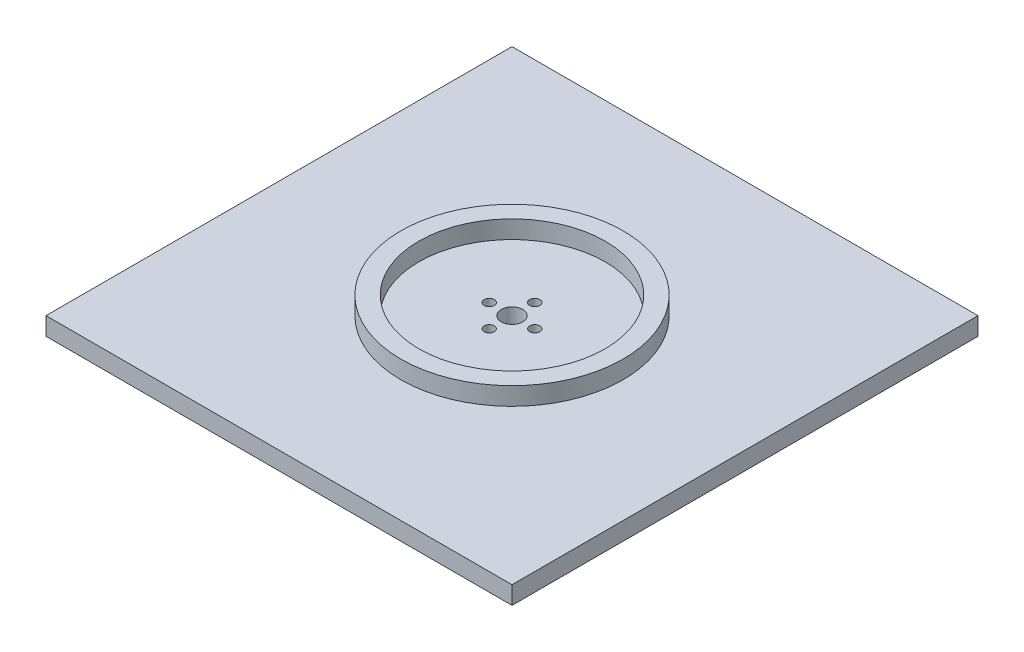
ISO-10303-21;
HEADER;
FILE_DESCRIPTION(('STEP AP214'),'2;1');
FILE_NAME('part.step','',(''),(''),'','','');
FILE_SCHEMA(('AUTOMOTIVE_DESIGN { 1 0 10303 214 1 1 1 1 }'));
ENDSEC;
DATA;
#1=APPLICATION_CONTEXT('core data for automotive mechanical design processes');
#2=APPLICATION_PROTOCOL_DEFINITION('international standard','automotive_design',2000,#1);
#3=PRODUCT_CONTEXT('',#1,'mechanical');
#4=PRODUCT('Part','Part','',(#3));
#5=PRODUCT_RELATED_PRODUCT_CATEGORY('part','',(#4));
#6=PRODUCT_DEFINITION_FORMATION('','',#4);
#7=PRODUCT_DEFINITION_CONTEXT('part definition',#1,'design');
#8=PRODUCT_DEFINITION('design','',#6,#7);
#9=PRODUCT_DEFINITION_SHAPE('','',#8);
#10=(LENGTH_UNIT() NAMED_UNIT(*) SI_UNIT(.MILLI.,.METRE.));
#11=(NAMED_UNIT(*) PLANE_ANGLE_UNIT() SI_UNIT($,.RADIAN.));
#12=(NAMED_UNIT(*) SI_UNIT($,.STERADIAN.) SOLID_ANGLE_UNIT());
#13=UNCERTAINTY_MEASURE_WITH_UNIT(LENGTH_MEASURE(1.E-05),#10,'distance_accuracy_value','');
#14=(GEOMETRIC_REPRESENTATION_CONTEXT(3) GLOBAL_UNCERTAINTY_ASSIGNED_CONTEXT((#13)) GLOBAL_UNIT_ASSIGNED_CONTEXT((#10,
#11,#12)) REPRESENTATION_CONTEXT('',''));
#15=CARTESIAN_POINT('',(0.,0.,0.));
#16=DIRECTION('',(0.,0.,1.));
#17=DIRECTION('',(1.,0.,0.));
#18=AXIS2_PLACEMENT_3D('',#15,#16,#17);
#19=CARTESIAN_POINT('',(0.,0.,-6.35));
#20=DIRECTION('',(0.,1.,0.));
#21=DIRECTION('',(0.,0.,1.));
#22=AXIS2_PLACEMENT_3D('',#19,#20,#21);
#23=CYLINDRICAL_SURFACE('',#22,1.42);
#24=CARTESIAN_POINT('',(0.,5.,-6.35));
#25=DIRECTION('',(0.,1.,0.));
#26=DIRECTION('',(0.,0.,1.));
#27=AXIS2_PLACEMENT_3D('',#24,#25,#26);
#28=CIRCLE('',#27,1.42);
#29=CARTESIAN_POINT('',(0.,5.,-4.93));
#30=VERTEX_POINT('',#29);
#31=EDGE_CURVE('E156',#30,#30,#28,.T.);
#32=ORIENTED_EDGE('',*,*,#31,.T.);
#33=EDGE_LOOP('',(#32));
#34=FACE_BOUND('',#33,.T.);
#35=CARTESIAN_POINT('',(0.,3.,-6.35));
#36=DIRECTION('',(0.,-1.,0.));
#37=DIRECTION('',(0.,0.,-1.));
#38=AXIS2_PLACEMENT_3D('',#35,#36,#37);
#39=CIRCLE('',#38,1.42);
#40=CARTESIAN_POINT('',(0.,3.,-7.77));
#41=VERTEX_POINT('',#40);
#42=EDGE_CURVE('E43',#41,#41,#39,.F.);
#43=ORIENTED_EDGE('',*,*,#42,.F.);
#44=EDGE_LOOP('',(#43));
#45=FACE_BOUND('',#44,.T.);
#46=ADVANCED_FACE('F39',(#34,#45),#23,.F.);
#47=CARTESIAN_POINT('',(3.59400408331214E-13,0.,6.35));
#48=DIRECTION('',(0.,1.,0.));
#49=DIRECTION('',(0.,0.,1.));
#50=AXIS2_PLACEMENT_3D('',#47,#48,#49);
#51=CYLINDRICAL_SURFACE('',#50,1.42);
#52=CARTESIAN_POINT('',(3.59400408331214E-13,5.,6.35));
#53=DIRECTION('',(0.,1.,0.));
#54=DIRECTION('',(0.,0.,1.));
#55=AXIS2_PLACEMENT_3D('',#52,#53,#54);
#56=CIRCLE('',#55,1.42);
#57=CARTESIAN_POINT('',(3.59400408331214E-13,5.,7.77));
#58=VERTEX_POINT('',#57);
#59=EDGE_CURVE('E147',#58,#58,#56,.T.);
#60=ORIENTED_EDGE('',*,*,#59,.T.);
#61=EDGE_LOOP('',(#60));
#62=FACE_BOUND('',#61,.T.);
#63=CARTESIAN_POINT('',(3.59400408331214E-13,3.,6.35));
#64=DIRECTION('',(0.,-1.,0.));
#65=DIRECTION('',(0.,0.,-1.));
#66=AXIS2_PLACEMENT_3D('',#63,#64,#65);
#67=CIRCLE('',#66,1.42);
#68=CARTESIAN_POINT('',(3.59400408331214E-13,3.,4.93));
#69=VERTEX_POINT('',#68);
#70=EDGE_CURVE('E127',#69,#69,#67,.F.);
#71=ORIENTED_EDGE('',*,*,#70,.F.);
#72=EDGE_LOOP('',(#71));
#73=FACE_BOUND('',#72,.T.);
#74=ADVANCED_FACE('F192',(#62,#73),#51,.F.);
#75=CARTESIAN_POINT('',(-6.34999999999982,0.,1.80477854883065E-13));
#76=DIRECTION('',(0.,1.,0.));
#77=DIRECTION('',(0.,0.,1.));
#78=AXIS2_PLACEMENT_3D('',#75,#76,#77);
#79=CYLINDRICAL_SURFACE('',#78,1.42);
#80=CARTESIAN_POINT('',(-6.34999999999982,5.,1.80477854883065E-13));
#81=DIRECTION('',(0.,1.,0.));
#82=DIRECTION('',(0.,0.,1.));
#83=AXIS2_PLACEMENT_3D('',#80,#81,#82);
#84=CIRCLE('',#83,1.42);
#85=CARTESIAN_POINT('',(-6.34999999999982,5.,1.42000000000018));
#86=VERTEX_POINT('',#85);
#87=EDGE_CURVE('E144',#86,#86,#84,.T.);
#88=ORIENTED_EDGE('',*,*,#87,.T.);
#89=EDGE_LOOP('',(#88));
#90=FACE_BOUND('',#89,.T.);
#91=CARTESIAN_POINT('',(-6.34999999999982,3.,1.80477854883065E-13));
#92=DIRECTION('',(0.,-1.,0.));
#93=DIRECTION('',(0.,0.,-1.));
#94=AXIS2_PLACEMENT_3D('',#91,#92,#93);
#95=CIRCLE('',#94,1.42);
#96=CARTESIAN_POINT('',(-6.34999999999982,3.,-1.41999999999982));
#97=VERTEX_POINT('',#96);
#98=EDGE_CURVE('E125',#97,#97,#95,.F.);
#99=ORIENTED_EDGE('',*,*,#98,.F.);
#100=EDGE_LOOP('',(#99));
#101=FACE_BOUND('',#100,.T.);
#102=ADVANCED_FACE('F199',(#90,#101),#79,.F.);
#103=CARTESIAN_POINT('',(6.35000000000018,0.,-1.79700204165607E-13));
#104=DIRECTION('',(0.,1.,0.));
#105=DIRECTION('',(0.,0.,1.));
#106=AXIS2_PLACEMENT_3D('',#103,#104,#105);
#107=CYLINDRICAL_SURFACE('',#106,1.42);
#108=CARTESIAN_POINT('',(6.35000000000018,5.,-1.79700204165607E-13));
#109=DIRECTION('',(0.,1.,0.));
#110=DIRECTION('',(0.,0.,1.));
#111=AXIS2_PLACEMENT_3D('',#108,#109,#110);
#112=CIRCLE('',#111,1.42);
#113=CARTESIAN_POINT('',(6.35000000000018,5.,1.41999999999982));
#114=VERTEX_POINT('',#113);
#115=EDGE_CURVE('E153',#114,#114,#112,.T.);
#116=ORIENTED_EDGE('',*,*,#115,.T.);
#117=EDGE_LOOP('',(#116));
#118=FACE_BOUND('',#117,.T.);
#119=CARTESIAN_POINT('',(6.35000000000018,3.,-1.79700204165607E-13));
#120=DIRECTION('',(0.,-1.,0.));
#121=DIRECTION('',(0.,0.,-1.));
#122=AXIS2_PLACEMENT_3D('',#119,#120,#121);
#123=CIRCLE('',#122,1.42);
#124=CARTESIAN_POINT('',(6.35000000000018,3.,-1.42000000000018));
#125=VERTEX_POINT('',#124);
#126=EDGE_CURVE('E120',#125,#125,#123,.F.);
#127=ORIENTED_EDGE('',*,*,#126,.F.);
#128=EDGE_LOOP('',(#127));
#129=FACE_BOUND('',#128,.T.);
#130=ADVANCED_FACE('F240',(#118,#129),#107,.F.);
#131=CARTESIAN_POINT('',(0.,5.,65.));
#132=DIRECTION('',(0.,0.,-1.));
#133=DIRECTION('',(-1.,0.,0.));
#134=AXIS2_PLACEMENT_3D('',#131,#132,#133);
#135=PLANE('',#134);
#136=DIRECTION('',(1.,0.,0.));
#137=VECTOR('',#136,1.);
#138=CARTESIAN_POINT('',(0.,0.,65.));
#139=LINE('',#138,#137);
#140=CARTESIAN_POINT('',(-65.,0.,65.));
#141=VERTEX_POINT('',#140);
#142=CARTESIAN_POINT('',(65.,0.,65.));
#143=VERTEX_POINT('',#142);
#144=EDGE_CURVE('E108',#141,#143,#139,.T.);
#145=ORIENTED_EDGE('',*,*,#144,.T.);
#146=DIRECTION('',(0.,-1.,0.));
#147=VECTOR('',#146,1.);
#148=CARTESIAN_POINT('',(65.,5.,65.));
#149=LINE('',#148,#147);
#150=CARTESIAN_POINT('',(65.,5.,65.));
#151=VERTEX_POINT('',#150);
#152=EDGE_CURVE('E49',#151,#143,#149,.T.);
#153=ORIENTED_EDGE('',*,*,#152,.F.);
#154=DIRECTION('',(1.,0.,0.));
#155=VECTOR('',#154,1.);
#156=CARTESIAN_POINT('',(0.,5.,65.));
#157=LINE('',#156,#155);
#158=CARTESIAN_POINT('',(-65.,5.,65.));
#159=VERTEX_POINT('',#158);
#160=EDGE_CURVE('E92',#159,#151,#157,.T.);
#161=ORIENTED_EDGE('',*,*,#160,.F.);
#162=DIRECTION('',(0.,-1.,0.));
#163=VECTOR('',#162,1.);
#164=CARTESIAN_POINT('',(-65.,5.,65.));
#165=LINE('',#164,#163);
#166=EDGE_CURVE('E58',#159,#141,#165,.T.);
#167=ORIENTED_EDGE('',*,*,#166,.T.);
#168=EDGE_LOOP('',(#145,#153,#161,#167));
#169=FACE_BOUND('',#168,.T.);
#170=ADVANCED_FACE('F41',(#169),#135,.F.);
#171=CARTESIAN_POINT('',(65.,5.,0.));
#172=DIRECTION('',(-1.,0.,0.));
#173=DIRECTION('',(0.,0.,1.));
#174=AXIS2_PLACEMENT_3D('',#171,#172,#173);
#175=PLANE('',#174);
#176=DIRECTION('',(0.,0.,-1.));
#177=VECTOR('',#176,1.);
#178=CARTESIAN_POINT('',(65.,0.,0.));
#179=LINE('',#178,#177);
#180=CARTESIAN_POINT('',(65.,0.,-65.));
#181=VERTEX_POINT('',#180);
#182=EDGE_CURVE('E98',#143,#181,#179,.T.);
#183=ORIENTED_EDGE('',*,*,#182,.T.);
#184=DIRECTION('',(0.,-1.,0.));
#185=VECTOR('',#184,1.);
#186=CARTESIAN_POINT('',(65.,5.,-65.));
#187=LINE('',#186,#185);
#188=CARTESIAN_POINT('',(65.,5.,-65.));
#189=VERTEX_POINT('',#188);
#190=EDGE_CURVE('E96',#189,#181,#187,.T.);
#191=ORIENTED_EDGE('',*,*,#190,.F.);
#192=DIRECTION('',(0.,0.,-1.));
#193=VECTOR('',#192,1.);
#194=CARTESIAN_POINT('',(65.,5.,0.));
#195=LINE('',#194,#193);
#196=EDGE_CURVE('E84',#151,#189,#195,.T.);
#197=ORIENTED_EDGE('',*,*,#196,.F.);
#198=ORIENTED_EDGE('',*,*,#152,.T.);
#199=EDGE_LOOP('',(#183,#191,#197,#198));
#200=FACE_BOUND('',#199,.T.);
#201=ADVANCED_FACE('F97',(#200),#175,.F.);
#202=CARTESIAN_POINT('',(0.,5.,-65.));
#203=DIRECTION('',(0.,0.,-1.));
#204=DIRECTION('',(-1.,0.,0.));
#205=AXIS2_PLACEMENT_3D('',#202,#203,#204);
#206=PLANE('',#205);
#207=DIRECTION('',(1.,0.,0.));
#208=VECTOR('',#207,1.);
#209=CARTESIAN_POINT('',(0.,0.,-65.));
#210=LINE('',#209,#208);
#211=CARTESIAN_POINT('',(-65.,0.,-65.));
#212=VERTEX_POINT('',#211);
#213=EDGE_CURVE('E112',#212,#181,#210,.T.);
#214=ORIENTED_EDGE('',*,*,#213,.F.);
#215=DIRECTION('',(0.,-1.,0.));
#216=VECTOR('',#215,1.);
#217=CARTESIAN_POINT('',(-65.,5.,-65.));
#218=LINE('',#217,#216);
#219=CARTESIAN_POINT('',(-65.,5.,-65.));
#220=VERTEX_POINT('',#219);
#221=EDGE_CURVE('E72',#220,#212,#218,.T.);
#222=ORIENTED_EDGE('',*,*,#221,.F.);
#223=DIRECTION('',(1.,0.,0.));
#224=VECTOR('',#223,1.);
#225=CARTESIAN_POINT('',(0.,5.,-65.));
#226=LINE('',#225,#224);
#227=EDGE_CURVE('E91',#220,#189,#226,.T.);
#228=ORIENTED_EDGE('',*,*,#227,.T.);
#229=ORIENTED_EDGE('',*,*,#190,.T.);
#230=EDGE_LOOP('',(#214,#222,#228,#229));
#231=FACE_BOUND('',#230,.T.);
#232=ADVANCED_FACE('F102',(#231),#206,.T.);
#233=CARTESIAN_POINT('',(-65.,5.,0.));
#234=DIRECTION('',(-1.,0.,0.));
#235=DIRECTION('',(0.,0.,1.));
#236=AXIS2_PLACEMENT_3D('',#233,#234,#235);
#237=PLANE('',#236);
#238=DIRECTION('',(0.,0.,-1.));
#239=VECTOR('',#238,1.);
#240=CARTESIAN_POINT('',(-65.,0.,0.));
#241=LINE('',#240,#239);
#242=EDGE_CURVE('E114',#141,#212,#241,.T.);
#243=ORIENTED_EDGE('',*,*,#242,.F.);
#244=ORIENTED_EDGE('',*,*,#166,.F.);
#245=DIRECTION('',(0.,0.,-1.));
#246=VECTOR('',#245,1.);
#247=CARTESIAN_POINT('',(-65.,5.,0.));
#248=LINE('',#247,#246);
#249=EDGE_CURVE('E103',#159,#220,#248,.T.);
#250=ORIENTED_EDGE('',*,*,#249,.T.);
#251=ORIENTED_EDGE('',*,*,#221,.T.);
#252=EDGE_LOOP('',(#243,#244,#250,#251));
#253=FACE_BOUND('',#252,.T.);
#254=ADVANCED_FACE('F174',(#253),#237,.T.);
#255=CARTESIAN_POINT('',(0.,5.,0.));
#256=DIRECTION('',(0.,1.,0.));
#257=DIRECTION('',(0.,0.,1.));
#258=AXIS2_PLACEMENT_3D('',#255,#256,#257);
#259=PLANE('',#258);
#260=CARTESIAN_POINT('',(0.,5.,0.));
#261=DIRECTION('',(0.,1.,0.));
#262=DIRECTION('',(0.,0.,1.));
#263=AXIS2_PLACEMENT_3D('',#260,#261,#262);
#264=CIRCLE('',#263,31.);
#265=CARTESIAN_POINT('',(0.,5.,31.));
#266=VERTEX_POINT('',#265);
#267=EDGE_CURVE('E164',#266,#266,#264,.T.);
#268=ORIENTED_EDGE('',*,*,#267,.F.);
#269=EDGE_LOOP('',(#268));
#270=FACE_BOUND('',#269,.T.);
#271=ORIENTED_EDGE('',*,*,#160,.T.);
#272=ORIENTED_EDGE('',*,*,#196,.T.);
#273=ORIENTED_EDGE('',*,*,#227,.F.);
#274=ORIENTED_EDGE('',*,*,#249,.F.);
#275=EDGE_LOOP('',(#271,#272,#273,#274));
#276=FACE_BOUND('',#275,.T.);
#277=ADVANCED_FACE('F88',(#270,#276),#259,.T.);
#278=CARTESIAN_POINT('',(0.,0.,0.));
#279=DIRECTION('',(0.,1.,0.));
#280=DIRECTION('',(0.,0.,1.));
#281=AXIS2_PLACEMENT_3D('',#278,#279,#280);
#282=PLANE('',#281);
#283=CARTESIAN_POINT('',(0.,0.,-6.35000000000036));
#284=DIRECTION('',(0.,-1.,0.));
#285=DIRECTION('',(0.,0.,-1.));
#286=AXIS2_PLACEMENT_3D('',#283,#284,#285);
#287=CIRCLE('',#286,3.00000000000023);
#288=CARTESIAN_POINT('',(0.,0.,-9.35000000000059));
#289=VERTEX_POINT('',#288);
#290=EDGE_CURVE('E351',#289,#289,#287,.T.);
#291=ORIENTED_EDGE('',*,*,#290,.F.);
#292=EDGE_LOOP('',(#291));
#293=FACE_BOUND('',#292,.T.);
#294=CARTESIAN_POINT('',(-6.35000000000018,0.,-1.77367252013231E-13));
#295=DIRECTION('',(0.,-1.,0.));
#296=DIRECTION('',(0.,0.,-1.));
#297=AXIS2_PLACEMENT_3D('',#294,#295,#296);
#298=CIRCLE('',#297,3.00000000000012);
#299=CARTESIAN_POINT('',(-6.35000000000018,0.,-3.00000000000029));
#300=VERTEX_POINT('',#299);
#301=EDGE_CURVE('E356',#300,#300,#298,.T.);
#302=ORIENTED_EDGE('',*,*,#301,.F.);
#303=EDGE_LOOP('',(#302));
#304=FACE_BOUND('',#303,.T.);
#305=CARTESIAN_POINT('',(0.,0.,6.35));
#306=DIRECTION('',(0.,-1.,0.));
#307=DIRECTION('',(0.,0.,-1.));
#308=AXIS2_PLACEMENT_3D('',#305,#306,#307);
#309=CIRCLE('',#308,2.9999999999999);
#310=CARTESIAN_POINT('',(0.,0.,3.3500000000001));
#311=VERTEX_POINT('',#310);
#312=EDGE_CURVE('E363',#311,#311,#309,.T.);
#313=ORIENTED_EDGE('',*,*,#312,.F.);
#314=EDGE_LOOP('',(#313));
#315=FACE_BOUND('',#314,.T.);
#316=CARTESIAN_POINT('',(6.35000000000018,0.,-1.79700204165607E-13));
#317=DIRECTION('',(0.,-1.,0.));
#318=DIRECTION('',(0.,0.,-1.));
#319=AXIS2_PLACEMENT_3D('',#316,#317,#318);
#320=CIRCLE('',#319,3.);
#321=CARTESIAN_POINT('',(6.35000000000018,0.,-3.00000000000018));
#322=VERTEX_POINT('',#321);
#323=EDGE_CURVE('E133',#322,#322,#320,.T.);
#324=ORIENTED_EDGE('',*,*,#323,.F.);
#325=EDGE_LOOP('',(#324));
#326=FACE_BOUND('',#325,.T.);
#327=CARTESIAN_POINT('',(0.,0.,0.));
#328=DIRECTION('',(0.,1.,0.));
#329=DIRECTION('',(0.,0.,1.));
#330=AXIS2_PLACEMENT_3D('',#327,#328,#329);
#331=CIRCLE('',#330,3.);
#332=CARTESIAN_POINT('',(0.,0.,3.));
#333=VERTEX_POINT('',#332);
#334=EDGE_CURVE('E148',#333,#333,#331,.T.);
#335=ORIENTED_EDGE('',*,*,#334,.T.);
#336=EDGE_LOOP('',(#335));
#337=FACE_BOUND('',#336,.T.);
#338=ORIENTED_EDGE('',*,*,#144,.F.);
#339=ORIENTED_EDGE('',*,*,#242,.T.);
#340=ORIENTED_EDGE('',*,*,#213,.T.);
#341=ORIENTED_EDGE('',*,*,#182,.F.);
#342=EDGE_LOOP('',(#338,#339,#340,#341));
#343=FACE_BOUND('',#342,.T.);
#344=ADVANCED_FACE('F173',(#293,#304,#315,#326,#337,#343),#282,.F.);
#345=CARTESIAN_POINT('',(0.,10.,0.));
#346=DIRECTION('',(0.,1.,0.));
#347=DIRECTION('',(0.,0.,1.));
#348=AXIS2_PLACEMENT_3D('',#345,#346,#347);
#349=PLANE('',#348);
#350=CARTESIAN_POINT('',(0.,10.,0.));
#351=DIRECTION('',(0.,1.,0.));
#352=DIRECTION('',(0.,0.,1.));
#353=AXIS2_PLACEMENT_3D('',#350,#351,#352);
#354=CIRCLE('',#353,31.);
#355=CARTESIAN_POINT('',(0.,10.,31.));
#356=VERTEX_POINT('',#355);
#357=EDGE_CURVE('E110',#356,#356,#354,.T.);
#358=ORIENTED_EDGE('',*,*,#357,.T.);
#359=EDGE_LOOP('',(#358));
#360=FACE_BOUND('',#359,.T.);
#361=CARTESIAN_POINT('',(0.,10.,0.));
#362=DIRECTION('',(0.,1.,0.));
#363=DIRECTION('',(0.,0.,1.));
#364=AXIS2_PLACEMENT_3D('',#361,#362,#363);
#365=CIRCLE('',#364,26.);
#366=CARTESIAN_POINT('',(0.,10.,26.));
#367=VERTEX_POINT('',#366);
#368=EDGE_CURVE('E161',#367,#367,#365,.T.);
#369=ORIENTED_EDGE('',*,*,#368,.F.);
#370=EDGE_LOOP('',(#369));
#371=FACE_BOUND('',#370,.T.);
#372=ADVANCED_FACE('F182',(#360,#371),#349,.T.);
#373=CARTESIAN_POINT('',(0.,10.,0.));
#374=DIRECTION('',(0.,-1.,0.));
#375=DIRECTION('',(0.,0.,-1.));
#376=AXIS2_PLACEMENT_3D('',#373,#374,#375);
#377=CYLINDRICAL_SURFACE('',#376,31.);
#378=ORIENTED_EDGE('',*,*,#357,.F.);
#379=EDGE_LOOP('',(#378));
#380=FACE_BOUND('',#379,.T.);
#381=ORIENTED_EDGE('',*,*,#267,.T.);
#382=EDGE_LOOP('',(#381));
#383=FACE_BOUND('',#382,.T.);
#384=ADVANCED_FACE('F170',(#380,#383),#377,.T.);
#385=CARTESIAN_POINT('',(0.,10.,0.));
#386=DIRECTION('',(0.,-1.,0.));
#387=DIRECTION('',(0.,0.,-1.));
#388=AXIS2_PLACEMENT_3D('',#385,#386,#387);
#389=CYLINDRICAL_SURFACE('',#388,26.);
#390=ORIENTED_EDGE('',*,*,#368,.T.);
#391=EDGE_LOOP('',(#390));
#392=FACE_BOUND('',#391,.T.);
#393=CARTESIAN_POINT('',(0.,5.,0.));
#394=DIRECTION('',(0.,1.,0.));
#395=DIRECTION('',(0.,0.,1.));
#396=AXIS2_PLACEMENT_3D('',#393,#394,#395);
#397=CIRCLE('',#396,26.);
#398=CARTESIAN_POINT('',(0.,5.,26.));
#399=VERTEX_POINT('',#398);
#400=EDGE_CURVE('E11',#399,#399,#397,.F.);
#401=ORIENTED_EDGE('',*,*,#400,.T.);
#402=EDGE_LOOP('',(#401));
#403=FACE_BOUND('',#402,.T.);
#404=ADVANCED_FACE('F189',(#392,#403),#389,.F.);
#405=CARTESIAN_POINT('',(0.,5.,0.));
#406=DIRECTION('',(0.,1.,0.));
#407=DIRECTION('',(0.,0.,1.));
#408=AXIS2_PLACEMENT_3D('',#405,#406,#407);
#409=CIRCLE('',#408,3.);
#410=CARTESIAN_POINT('',(0.,5.,3.));
#411=VERTEX_POINT('',#410);
#412=EDGE_CURVE('E123',#411,#411,#409,.T.);
#413=ORIENTED_EDGE('',*,*,#412,.F.);
#414=EDGE_LOOP('',(#413));
#415=FACE_BOUND('',#414,.T.);
#416=ORIENTED_EDGE('',*,*,#87,.F.);
#417=EDGE_LOOP('',(#416));
#418=FACE_BOUND('',#417,.T.);
#419=ORIENTED_EDGE('',*,*,#59,.F.);
#420=EDGE_LOOP('',(#419));
#421=FACE_BOUND('',#420,.T.);
#422=ORIENTED_EDGE('',*,*,#115,.F.);
#423=EDGE_LOOP('',(#422));
#424=FACE_BOUND('',#423,.T.);
#425=ORIENTED_EDGE('',*,*,#31,.F.);
#426=EDGE_LOOP('',(#425));
#427=FACE_BOUND('',#426,.T.);
#428=ORIENTED_EDGE('',*,*,#400,.F.);
#429=EDGE_LOOP('',(#428));
#430=FACE_BOUND('',#429,.T.);
#431=ADVANCED_FACE('F176',(#415,#418,#421,#424,#427,#430),#259,.T.);
#432=CARTESIAN_POINT('',(0.,0.,0.));
#433=DIRECTION('',(0.,1.,0.));
#434=DIRECTION('',(0.,0.,1.));
#435=AXIS2_PLACEMENT_3D('',#432,#433,#434);
#436=CYLINDRICAL_SURFACE('',#435,3.);
#437=ORIENTED_EDGE('',*,*,#334,.F.);
#438=EDGE_LOOP('',(#437));
#439=FACE_BOUND('',#438,.T.);
#440=ORIENTED_EDGE('',*,*,#412,.T.);
#441=EDGE_LOOP('',(#440));
#442=FACE_BOUND('',#441,.T.);
#443=ADVANCED_FACE('F188',(#439,#442),#436,.F.);
#444=CARTESIAN_POINT('',(6.35000000000018,3.,-1.79700204165607E-13));
#445=DIRECTION('',(0.,-1.,0.));
#446=DIRECTION('',(0.,0.,-1.));
#447=AXIS2_PLACEMENT_3D('',#444,#445,#446);
#448=PLANE('',#447);
#449=CARTESIAN_POINT('',(6.35000000000018,3.,-1.79700204165607E-13));
#450=DIRECTION('',(0.,-1.,0.));
#451=DIRECTION('',(0.,0.,-1.));
#452=AXIS2_PLACEMENT_3D('',#449,#450,#451);
#453=CIRCLE('',#452,3.);
#454=CARTESIAN_POINT('',(6.35000000000018,3.,-3.00000000000018));
#455=VERTEX_POINT('',#454);
#456=EDGE_CURVE('E124',#455,#455,#453,.T.);
#457=ORIENTED_EDGE('',*,*,#456,.T.);
#458=EDGE_LOOP('',(#457));
#459=FACE_BOUND('',#458,.T.);
#460=ORIENTED_EDGE('',*,*,#126,.T.);
#461=EDGE_LOOP('',(#460));
#462=FACE_BOUND('',#461,.T.);
#463=ADVANCED_FACE('F235',(#459,#462),#448,.T.);
#464=CARTESIAN_POINT('',(6.35000000000018,3.,-1.79700204165607E-13));
#465=DIRECTION('',(0.,-1.,0.));
#466=DIRECTION('',(0.,0.,-1.));
#467=AXIS2_PLACEMENT_3D('',#464,#465,#466);
#468=CYLINDRICAL_SURFACE('',#467,3.);
#469=ORIENTED_EDGE('',*,*,#456,.F.);
#470=EDGE_LOOP('',(#469));
#471=FACE_BOUND('',#470,.T.);
#472=ORIENTED_EDGE('',*,*,#323,.T.);
#473=EDGE_LOOP('',(#472));
#474=FACE_BOUND('',#473,.T.);
#475=ADVANCED_FACE('F272',(#471,#474),#468,.F.);
#476=CARTESIAN_POINT('',(-6.35000000000018,3.,-1.77367252013231E-13));
#477=DIRECTION('',(0.,-1.,0.));
#478=DIRECTION('',(0.,0.,-1.));
#479=AXIS2_PLACEMENT_3D('',#476,#477,#478);
#480=PLANE('',#479);
#481=CARTESIAN_POINT('',(-6.35000000000018,3.,-1.77367252013231E-13));
#482=DIRECTION('',(0.,-1.,0.));
#483=DIRECTION('',(0.,0.,-1.));
#484=AXIS2_PLACEMENT_3D('',#481,#482,#483);
#485=CIRCLE('',#484,3.00000000000012);
#486=CARTESIAN_POINT('',(-6.35000000000018,3.,-3.00000000000029));
#487=VERTEX_POINT('',#486);
#488=EDGE_CURVE('E352',#487,#487,#485,.T.);
#489=ORIENTED_EDGE('',*,*,#488,.T.);
#490=EDGE_LOOP('',(#489));
#491=FACE_BOUND('',#490,.T.);
#492=ORIENTED_EDGE('',*,*,#98,.T.);
#493=EDGE_LOOP('',(#492));
#494=FACE_BOUND('',#493,.T.);
#495=ADVANCED_FACE('F279',(#491,#494),#480,.T.);
#496=CARTESIAN_POINT('',(-6.35000000000018,3.,-1.77367252013231E-13));
#497=DIRECTION('',(0.,-1.,0.));
#498=DIRECTION('',(0.,0.,-1.));
#499=AXIS2_PLACEMENT_3D('',#496,#497,#498);
#500=CYLINDRICAL_SURFACE('',#499,3.00000000000012);
#501=ORIENTED_EDGE('',*,*,#488,.F.);
#502=EDGE_LOOP('',(#501));
#503=FACE_BOUND('',#502,.T.);
#504=ORIENTED_EDGE('',*,*,#301,.T.);
#505=EDGE_LOOP('',(#504));
#506=FACE_BOUND('',#505,.T.);
#507=ADVANCED_FACE('F287',(#503,#506),#500,.F.);
#508=CARTESIAN_POINT('',(0.,3.,6.35));
#509=DIRECTION('',(0.,-1.,0.));
#510=DIRECTION('',(0.,0.,-1.));
#511=AXIS2_PLACEMENT_3D('',#508,#509,#510);
#512=PLANE('',#511);
#513=CARTESIAN_POINT('',(0.,3.,6.35));
#514=DIRECTION('',(0.,-1.,0.));
#515=DIRECTION('',(0.,0.,-1.));
#516=AXIS2_PLACEMENT_3D('',#513,#514,#515);
#517=CIRCLE('',#516,2.9999999999999);
#518=CARTESIAN_POINT('',(0.,3.,3.3500000000001));
#519=VERTEX_POINT('',#518);
#520=EDGE_CURVE('E361',#519,#519,#517,.T.);
#521=ORIENTED_EDGE('',*,*,#520,.T.);
#522=EDGE_LOOP('',(#521));
#523=FACE_BOUND('',#522,.T.);
#524=ORIENTED_EDGE('',*,*,#70,.T.);
#525=EDGE_LOOP('',(#524));
#526=FACE_BOUND('',#525,.T.);
#527=ADVANCED_FACE('F295',(#523,#526),#512,.T.);
#528=CARTESIAN_POINT('',(0.,3.,6.35));
#529=DIRECTION('',(0.,-1.,0.));
#530=DIRECTION('',(0.,0.,-1.));
#531=AXIS2_PLACEMENT_3D('',#528,#529,#530);
#532=CYLINDRICAL_SURFACE('',#531,2.9999999999999);
#533=ORIENTED_EDGE('',*,*,#520,.F.);
#534=EDGE_LOOP('',(#533));
#535=FACE_BOUND('',#534,.T.);
#536=ORIENTED_EDGE('',*,*,#312,.T.);
#537=EDGE_LOOP('',(#536));
#538=FACE_BOUND('',#537,.T.);
#539=ADVANCED_FACE('F303',(#535,#538),#532,.F.);
#540=CARTESIAN_POINT('',(0.,3.,-6.35000000000036));
#541=DIRECTION('',(0.,-1.,0.));
#542=DIRECTION('',(0.,0.,-1.));
#543=AXIS2_PLACEMENT_3D('',#540,#541,#542);
#544=PLANE('',#543);
#545=CARTESIAN_POINT('',(0.,3.,-6.35000000000036));
#546=DIRECTION('',(0.,-1.,0.));
#547=DIRECTION('',(0.,0.,-1.));
#548=AXIS2_PLACEMENT_3D('',#545,#546,#547);
#549=CIRCLE('',#548,3.00000000000023);
#550=CARTESIAN_POINT('',(0.,3.,-9.35000000000059));
#551=VERTEX_POINT('',#550);
#552=EDGE_CURVE('E128',#551,#551,#549,.T.);
#553=ORIENTED_EDGE('',*,*,#552,.T.);
#554=EDGE_LOOP('',(#553));
#555=FACE_BOUND('',#554,.T.);
#556=ORIENTED_EDGE('',*,*,#42,.T.);
#557=EDGE_LOOP('',(#556));
#558=FACE_BOUND('',#557,.T.);
#559=ADVANCED_FACE('F311',(#555,#558),#544,.T.);
#560=CARTESIAN_POINT('',(0.,3.,-6.35000000000036));
#561=DIRECTION('',(0.,-1.,0.));
#562=DIRECTION('',(0.,0.,-1.));
#563=AXIS2_PLACEMENT_3D('',#560,#561,#562);
#564=CYLINDRICAL_SURFACE('',#563,3.00000000000023);
#565=ORIENTED_EDGE('',*,*,#552,.F.);
#566=EDGE_LOOP('',(#565));
#567=FACE_BOUND('',#566,.T.);
#568=ORIENTED_EDGE('',*,*,#290,.T.);
#569=EDGE_LOOP('',(#568));
#570=FACE_BOUND('',#569,.T.);
#571=ADVANCED_FACE('F319',(#567,#570),#564,.F.);
#572=CLOSED_SHELL('',(#46,#74,#102,#130,#170,#201,#232,#254,#277,#344,#372,#384,#404,#431,#443,
#463,#475,#495,#507,#527,#539,#559,#571));
#573=MANIFOLD_SOLID_BREP('B2',#572);
#574=ADVANCED_BREP_SHAPE_REPRESENTATION('',(#18,#573),#14);
#575=SHAPE_DEFINITION_REPRESENTATION(#9,#574);
ENDSEC;
END-ISO-10303-21;
